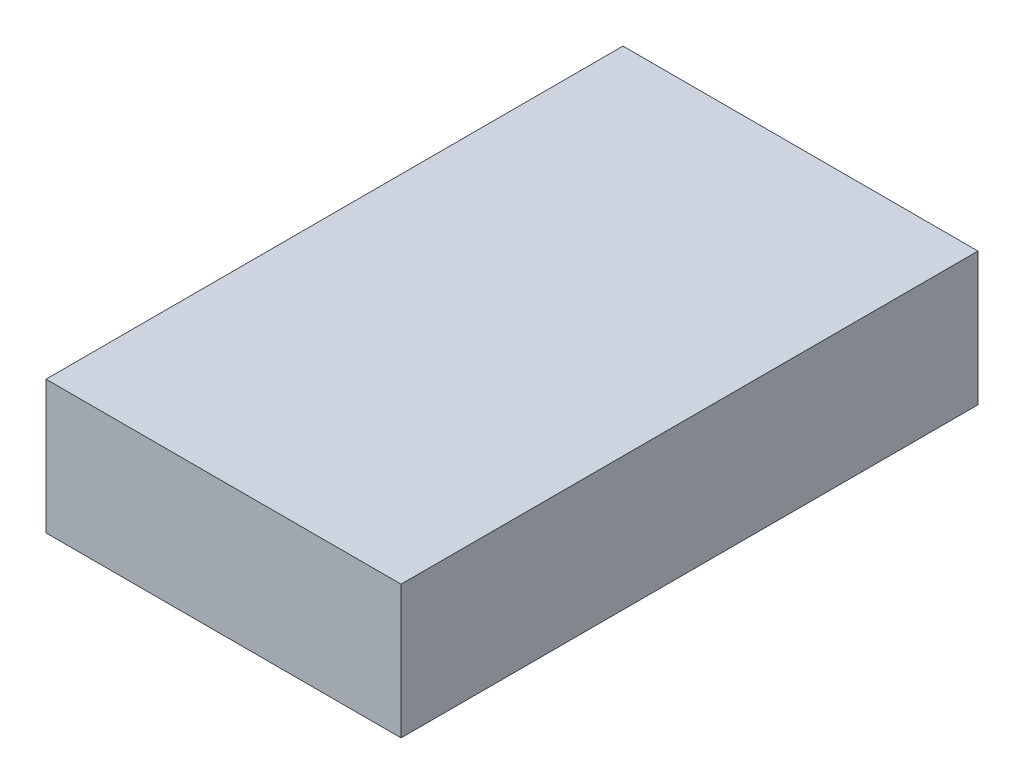
ISO-10303-21;
HEADER;
FILE_DESCRIPTION(('STEP AP214'),'2;1');
FILE_NAME('part.step','',(''),(''),'','','');
FILE_SCHEMA(('AUTOMOTIVE_DESIGN { 1 0 10303 214 1 1 1 1 }'));
ENDSEC;
DATA;
#1=APPLICATION_CONTEXT('core data for automotive mechanical design processes');
#2=APPLICATION_PROTOCOL_DEFINITION('international standard','automotive_design',2000,#1);
#3=PRODUCT_CONTEXT('',#1,'mechanical');
#4=PRODUCT('Part','Part','',(#3));
#5=PRODUCT_RELATED_PRODUCT_CATEGORY('part','',(#4));
#6=PRODUCT_DEFINITION_FORMATION('','',#4);
#7=PRODUCT_DEFINITION_CONTEXT('part definition',#1,'design');
#8=PRODUCT_DEFINITION('design','',#6,#7);
#9=PRODUCT_DEFINITION_SHAPE('','',#8);
#10=(LENGTH_UNIT() NAMED_UNIT(*) SI_UNIT(.MILLI.,.METRE.));
#11=(NAMED_UNIT(*) PLANE_ANGLE_UNIT() SI_UNIT($,.RADIAN.));
#12=(NAMED_UNIT(*) SI_UNIT($,.STERADIAN.) SOLID_ANGLE_UNIT());
#13=UNCERTAINTY_MEASURE_WITH_UNIT(LENGTH_MEASURE(1.E-05),#10,'distance_accuracy_value','');
#14=(GEOMETRIC_REPRESENTATION_CONTEXT(3) GLOBAL_UNCERTAINTY_ASSIGNED_CONTEXT((#13)) GLOBAL_UNIT_ASSIGNED_CONTEXT((#10,
#11,#12)) REPRESENTATION_CONTEXT('',''));
#15=CARTESIAN_POINT('',(0.,0.,0.));
#16=DIRECTION('',(0.,0.,1.));
#17=DIRECTION('',(1.,0.,0.));
#18=AXIS2_PLACEMENT_3D('',#15,#16,#17);
#19=CARTESIAN_POINT('',(406.4,-38.1,-508.));
#20=DIRECTION('',(1.,0.,0.));
#21=DIRECTION('',(0.,0.,-1.));
#22=AXIS2_PLACEMENT_3D('',#19,#20,#21);
#23=PLANE('',#22);
#24=DIRECTION('',(0.,0.,1.));
#25=VECTOR('',#24,1.);
#26=CARTESIAN_POINT('',(406.4,38.1,-508.));
#27=LINE('',#26,#25);
#28=CARTESIAN_POINT('',(406.4,38.1,-508.));
#29=VERTEX_POINT('',#28);
#30=CARTESIAN_POINT('',(406.4,38.1,-177.8));
#31=VERTEX_POINT('',#30);
#32=EDGE_CURVE('E36',#29,#31,#27,.T.);
#33=ORIENTED_EDGE('',*,*,#32,.T.);
#34=DIRECTION('',(0.,1.,0.));
#35=VECTOR('',#34,1.);
#36=CARTESIAN_POINT('',(406.4,-38.1,-177.8));
#37=LINE('',#36,#35);
#38=CARTESIAN_POINT('',(406.4,-38.1,-177.8));
#39=VERTEX_POINT('',#38);
#40=EDGE_CURVE('E73',#39,#31,#37,.T.);
#41=ORIENTED_EDGE('',*,*,#40,.F.);
#42=DIRECTION('',(0.,0.,1.));
#43=VECTOR('',#42,1.);
#44=CARTESIAN_POINT('',(406.4,-38.1,-508.));
#45=LINE('',#44,#43);
#46=CARTESIAN_POINT('',(406.4,-38.1,-508.));
#47=VERTEX_POINT('',#46);
#48=EDGE_CURVE('E11',#47,#39,#45,.T.);
#49=ORIENTED_EDGE('',*,*,#48,.F.);
#50=DIRECTION('',(0.,1.,0.));
#51=VECTOR('',#50,1.);
#52=CARTESIAN_POINT('',(406.4,-38.1,-508.));
#53=LINE('',#52,#51);
#54=EDGE_CURVE('E74',#47,#29,#53,.T.);
#55=ORIENTED_EDGE('',*,*,#54,.T.);
#56=EDGE_LOOP('',(#33,#41,#49,#55));
#57=FACE_BOUND('',#56,.T.);
#58=ADVANCED_FACE('F33',(#57),#23,.T.);
#59=CARTESIAN_POINT('',(406.4,-38.1,-508.));
#60=DIRECTION('',(0.,-1.,0.));
#61=DIRECTION('',(0.,0.,-1.));
#62=AXIS2_PLACEMENT_3D('',#59,#60,#61);
#63=PLANE('',#62);
#64=ORIENTED_EDGE('',*,*,#48,.T.);
#65=DIRECTION('',(1.,0.,0.));
#66=VECTOR('',#65,1.);
#67=CARTESIAN_POINT('',(406.4,-38.1,-177.8));
#68=LINE('',#67,#66);
#69=CARTESIAN_POINT('',(203.2,-38.1,-177.8));
#70=VERTEX_POINT('',#69);
#71=EDGE_CURVE('E90',#70,#39,#68,.T.);
#72=ORIENTED_EDGE('',*,*,#71,.F.);
#73=DIRECTION('',(0.,0.,1.));
#74=VECTOR('',#73,1.);
#75=CARTESIAN_POINT('',(203.2,-38.1,-508.));
#76=LINE('',#75,#74);
#77=CARTESIAN_POINT('',(203.2,-38.1,-508.));
#78=VERTEX_POINT('',#77);
#79=EDGE_CURVE('E41',#78,#70,#76,.T.);
#80=ORIENTED_EDGE('',*,*,#79,.F.);
#81=DIRECTION('',(1.,0.,0.));
#82=VECTOR('',#81,1.);
#83=CARTESIAN_POINT('',(406.4,-38.1,-508.));
#84=LINE('',#83,#82);
#85=EDGE_CURVE('E79',#78,#47,#84,.T.);
#86=ORIENTED_EDGE('',*,*,#85,.T.);
#87=EDGE_LOOP('',(#64,#72,#80,#86));
#88=FACE_BOUND('',#87,.T.);
#89=ADVANCED_FACE('F105',(#88),#63,.T.);
#90=CARTESIAN_POINT('',(203.2,-38.1,-508.));
#91=DIRECTION('',(-1.,0.,0.));
#92=DIRECTION('',(0.,0.,1.));
#93=AXIS2_PLACEMENT_3D('',#90,#91,#92);
#94=PLANE('',#93);
#95=ORIENTED_EDGE('',*,*,#79,.T.);
#96=DIRECTION('',(0.,-1.,0.));
#97=VECTOR('',#96,1.);
#98=CARTESIAN_POINT('',(203.2,-38.1,-177.8));
#99=LINE('',#98,#97);
#100=CARTESIAN_POINT('',(203.2,38.1,-177.8));
#101=VERTEX_POINT('',#100);
#102=EDGE_CURVE('E86',#101,#70,#99,.T.);
#103=ORIENTED_EDGE('',*,*,#102,.F.);
#104=DIRECTION('',(0.,0.,1.));
#105=VECTOR('',#104,1.);
#106=CARTESIAN_POINT('',(203.2,38.1,-508.));
#107=LINE('',#106,#105);
#108=CARTESIAN_POINT('',(203.2,38.1,-508.));
#109=VERTEX_POINT('',#108);
#110=EDGE_CURVE('E78',#109,#101,#107,.T.);
#111=ORIENTED_EDGE('',*,*,#110,.F.);
#112=DIRECTION('',(0.,-1.,0.));
#113=VECTOR('',#112,1.);
#114=CARTESIAN_POINT('',(203.2,-38.1,-508.));
#115=LINE('',#114,#113);
#116=EDGE_CURVE('E98',#109,#78,#115,.T.);
#117=ORIENTED_EDGE('',*,*,#116,.T.);
#118=EDGE_LOOP('',(#95,#103,#111,#117));
#119=FACE_BOUND('',#118,.T.);
#120=ADVANCED_FACE('F102',(#119),#94,.T.);
#121=CARTESIAN_POINT('',(406.4,38.1,-508.));
#122=DIRECTION('',(0.,1.,0.));
#123=DIRECTION('',(-1.,0.,0.));
#124=AXIS2_PLACEMENT_3D('',#121,#122,#123);
#125=PLANE('',#124);
#126=ORIENTED_EDGE('',*,*,#110,.T.);
#127=DIRECTION('',(-1.,0.,0.));
#128=VECTOR('',#127,1.);
#129=CARTESIAN_POINT('',(406.4,38.1,-177.8));
#130=LINE('',#129,#128);
#131=EDGE_CURVE('E81',#31,#101,#130,.T.);
#132=ORIENTED_EDGE('',*,*,#131,.F.);
#133=ORIENTED_EDGE('',*,*,#32,.F.);
#134=DIRECTION('',(-1.,0.,0.));
#135=VECTOR('',#134,1.);
#136=CARTESIAN_POINT('',(406.4,38.1,-508.));
#137=LINE('',#136,#135);
#138=EDGE_CURVE('E96',#29,#109,#137,.T.);
#139=ORIENTED_EDGE('',*,*,#138,.T.);
#140=EDGE_LOOP('',(#126,#132,#133,#139));
#141=FACE_BOUND('',#140,.T.);
#142=ADVANCED_FACE('F82',(#141),#125,.T.);
#143=CARTESIAN_POINT('',(406.4,-38.1,-508.));
#144=DIRECTION('',(0.,0.,1.));
#145=DIRECTION('',(1.,0.,0.));
#146=AXIS2_PLACEMENT_3D('',#143,#144,#145);
#147=PLANE('',#146);
#148=ORIENTED_EDGE('',*,*,#54,.F.);
#149=ORIENTED_EDGE('',*,*,#85,.F.);
#150=ORIENTED_EDGE('',*,*,#116,.F.);
#151=ORIENTED_EDGE('',*,*,#138,.F.);
#152=EDGE_LOOP('',(#148,#149,#150,#151));
#153=FACE_BOUND('',#152,.T.);
#154=ADVANCED_FACE('F107',(#153),#147,.F.);
#155=CARTESIAN_POINT('',(406.4,-38.1,-177.8));
#156=DIRECTION('',(0.,0.,1.));
#157=DIRECTION('',(1.,0.,0.));
#158=AXIS2_PLACEMENT_3D('',#155,#156,#157);
#159=PLANE('',#158);
#160=ORIENTED_EDGE('',*,*,#40,.T.);
#161=ORIENTED_EDGE('',*,*,#131,.T.);
#162=ORIENTED_EDGE('',*,*,#102,.T.);
#163=ORIENTED_EDGE('',*,*,#71,.T.);
#164=EDGE_LOOP('',(#160,#161,#162,#163));
#165=FACE_BOUND('',#164,.T.);
#166=ADVANCED_FACE('F89',(#165),#159,.T.);
#167=CLOSED_SHELL('',(#58,#89,#120,#142,#154,#166));
#168=MANIFOLD_SOLID_BREP('B2',#167);
#169=ADVANCED_BREP_SHAPE_REPRESENTATION('',(#18,#168),#14);
#170=SHAPE_DEFINITION_REPRESENTATION(#9,#169);
ENDSEC;
END-ISO-10303-21;
